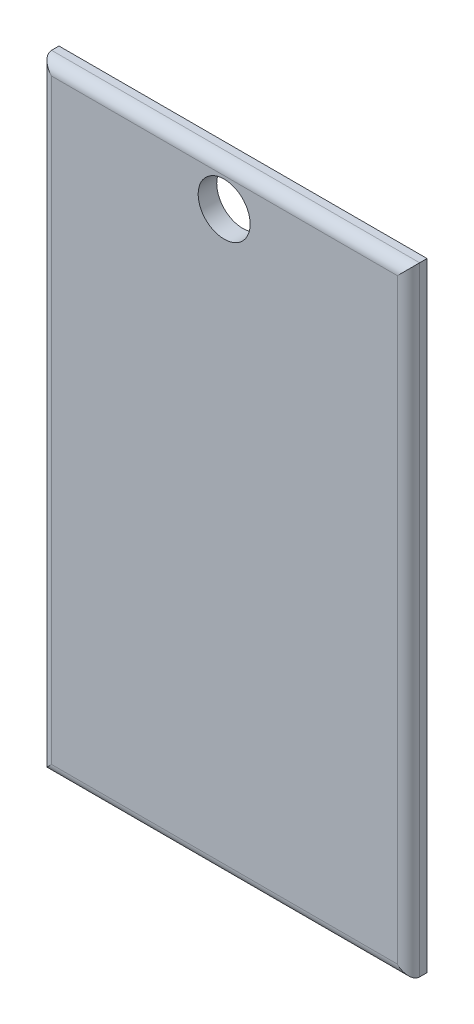
ISO-10303-21;
HEADER;
FILE_DESCRIPTION(('STEP AP214'),'2;1');
FILE_NAME('part.step','',(''),(''),'','','');
FILE_SCHEMA(('AUTOMOTIVE_DESIGN { 1 0 10303 214 1 1 1 1 }'));
ENDSEC;
DATA;
#1=APPLICATION_CONTEXT('core data for automotive mechanical design processes');
#2=APPLICATION_PROTOCOL_DEFINITION('international standard','automotive_design',2000,#1);
#3=PRODUCT_CONTEXT('',#1,'mechanical');
#4=PRODUCT('Part','Part','',(#3));
#5=PRODUCT_RELATED_PRODUCT_CATEGORY('part','',(#4));
#6=PRODUCT_DEFINITION_FORMATION('','',#4);
#7=PRODUCT_DEFINITION_CONTEXT('part definition',#1,'design');
#8=PRODUCT_DEFINITION('design','',#6,#7);
#9=PRODUCT_DEFINITION_SHAPE('','',#8);
#10=(LENGTH_UNIT() NAMED_UNIT(*) SI_UNIT(.MILLI.,.METRE.));
#11=(NAMED_UNIT(*) PLANE_ANGLE_UNIT() SI_UNIT($,.RADIAN.));
#12=(NAMED_UNIT(*) SI_UNIT($,.STERADIAN.) SOLID_ANGLE_UNIT());
#13=UNCERTAINTY_MEASURE_WITH_UNIT(LENGTH_MEASURE(1.E-05),#10,'distance_accuracy_value','');
#14=(GEOMETRIC_REPRESENTATION_CONTEXT(3) GLOBAL_UNCERTAINTY_ASSIGNED_CONTEXT((#13)) GLOBAL_UNIT_ASSIGNED_CONTEXT((#10,
#11,#12)) REPRESENTATION_CONTEXT('',''));
#15=CARTESIAN_POINT('',(0.,0.,0.));
#16=DIRECTION('',(0.,0.,1.));
#17=DIRECTION('',(1.,0.,0.));
#18=AXIS2_PLACEMENT_3D('',#15,#16,#17);
#19=CARTESIAN_POINT('',(-44.0525358152407,94.6577628041884,5.));
#20=DIRECTION('',(1.,0.,0.));
#21=DIRECTION('',(0.,1.,0.));
#22=AXIS2_PLACEMENT_3D('',#19,#20,#21);
#23=PLANE('',#22);
#24=DIRECTION('',(0.,0.,-1.));
#25=VECTOR('',#24,1.);
#26=CARTESIAN_POINT('',(-44.0525358152407,-71.8622371958116,5.));
#27=LINE('',#26,#25);
#28=CARTESIAN_POINT('',(-44.0525358152407,-71.8622371958116,2.));
#29=VERTEX_POINT('',#28);
#30=CARTESIAN_POINT('',(-44.0525358152407,-71.8622371958116,0.));
#31=VERTEX_POINT('',#30);
#32=EDGE_CURVE('E86',#29,#31,#27,.T.);
#33=ORIENTED_EDGE('',*,*,#32,.F.);
#34=DIRECTION('',(0.,-1.,0.));
#35=VECTOR('',#34,1.);
#36=CARTESIAN_POINT('',(-44.0525358152407,94.6577628041884,2.));
#37=LINE('',#36,#35);
#38=CARTESIAN_POINT('',(-44.0525358152407,94.6577628041884,2.));
#39=VERTEX_POINT('',#38);
#40=EDGE_CURVE('E11',#29,#39,#37,.F.);
#41=ORIENTED_EDGE('',*,*,#40,.T.);
#42=DIRECTION('',(0.,0.,-1.));
#43=VECTOR('',#42,1.);
#44=CARTESIAN_POINT('',(-44.0525358152407,94.6577628041884,5.));
#45=LINE('',#44,#43);
#46=CARTESIAN_POINT('',(-44.0525358152407,94.6577628041884,0.));
#47=VERTEX_POINT('',#46);
#48=EDGE_CURVE('E106',#39,#47,#45,.T.);
#49=ORIENTED_EDGE('',*,*,#48,.T.);
#50=DIRECTION('',(0.,-1.,0.));
#51=VECTOR('',#50,1.);
#52=CARTESIAN_POINT('',(-44.0525358152407,94.6577628041884,0.));
#53=LINE('',#52,#51);
#54=EDGE_CURVE('E102',#47,#31,#53,.T.);
#55=ORIENTED_EDGE('',*,*,#54,.T.);
#56=EDGE_LOOP('',(#33,#41,#49,#55));
#57=FACE_BOUND('',#56,.T.);
#58=ADVANCED_FACE('F33',(#57),#23,.F.);
#59=CARTESIAN_POINT('',(-44.0525358152407,-71.8622371958116,5.));
#60=DIRECTION('',(0.,1.,0.));
#61=DIRECTION('',(0.,0.,1.));
#62=AXIS2_PLACEMENT_3D('',#59,#60,#61);
#63=PLANE('',#62);
#64=DIRECTION('',(0.,0.,-1.));
#65=VECTOR('',#64,1.);
#66=CARTESIAN_POINT('',(55.0474641847593,-71.8622371958116,5.));
#67=LINE('',#66,#65);
#68=CARTESIAN_POINT('',(55.0474641847593,-71.8622371958116,2.));
#69=VERTEX_POINT('',#68);
#70=CARTESIAN_POINT('',(55.0474641847593,-71.8622371958116,0.));
#71=VERTEX_POINT('',#70);
#72=EDGE_CURVE('E96',#69,#71,#67,.T.);
#73=ORIENTED_EDGE('',*,*,#72,.F.);
#74=DIRECTION('',(1.,0.,0.));
#75=VECTOR('',#74,1.);
#76=CARTESIAN_POINT('',(-44.0525358152407,-71.8622371958116,2.));
#77=LINE('',#76,#75);
#78=EDGE_CURVE('E93',#69,#29,#77,.F.);
#79=ORIENTED_EDGE('',*,*,#78,.T.);
#80=ORIENTED_EDGE('',*,*,#32,.T.);
#81=DIRECTION('',(1.,0.,0.));
#82=VECTOR('',#81,1.);
#83=CARTESIAN_POINT('',(-44.0525358152407,-71.8622371958116,0.));
#84=LINE('',#83,#82);
#85=EDGE_CURVE('E90',#31,#71,#84,.T.);
#86=ORIENTED_EDGE('',*,*,#85,.T.);
#87=EDGE_LOOP('',(#73,#79,#80,#86));
#88=FACE_BOUND('',#87,.T.);
#89=ADVANCED_FACE('F89',(#88),#63,.F.);
#90=CARTESIAN_POINT('',(55.0474641847593,94.6577628041884,5.));
#91=DIRECTION('',(-1.,0.,0.));
#92=DIRECTION('',(0.,-1.,0.));
#93=AXIS2_PLACEMENT_3D('',#90,#91,#92);
#94=PLANE('',#93);
#95=DIRECTION('',(0.,0.,-1.));
#96=VECTOR('',#95,1.);
#97=CARTESIAN_POINT('',(55.0474641847593,94.6577628041884,5.));
#98=LINE('',#97,#96);
#99=CARTESIAN_POINT('',(55.0474641847593,94.6577628041884,2.));
#100=VERTEX_POINT('',#99);
#101=CARTESIAN_POINT('',(55.0474641847593,94.6577628041884,0.));
#102=VERTEX_POINT('',#101);
#103=EDGE_CURVE('E119',#100,#102,#98,.T.);
#104=ORIENTED_EDGE('',*,*,#103,.F.);
#105=DIRECTION('',(0.,1.,0.));
#106=VECTOR('',#105,1.);
#107=CARTESIAN_POINT('',(55.0474641847593,-71.8622371958116,2.));
#108=LINE('',#107,#106);
#109=EDGE_CURVE('E131',#100,#69,#108,.F.);
#110=ORIENTED_EDGE('',*,*,#109,.T.);
#111=ORIENTED_EDGE('',*,*,#72,.T.);
#112=DIRECTION('',(0.,1.,0.));
#113=VECTOR('',#112,1.);
#114=CARTESIAN_POINT('',(55.0474641847593,94.6577628041884,0.));
#115=LINE('',#114,#113);
#116=EDGE_CURVE('E104',#71,#102,#115,.T.);
#117=ORIENTED_EDGE('',*,*,#116,.T.);
#118=EDGE_LOOP('',(#104,#110,#111,#117));
#119=FACE_BOUND('',#118,.T.);
#120=ADVANCED_FACE('F168',(#119),#94,.F.);
#121=CARTESIAN_POINT('',(-44.0525358152407,94.6577628041884,5.));
#122=DIRECTION('',(0.,-1.,0.));
#123=DIRECTION('',(0.,0.,-1.));
#124=AXIS2_PLACEMENT_3D('',#121,#122,#123);
#125=PLANE('',#124);
#126=ORIENTED_EDGE('',*,*,#48,.F.);
#127=DIRECTION('',(-1.,0.,0.));
#128=VECTOR('',#127,1.);
#129=CARTESIAN_POINT('',(55.0474641847593,94.6577628041884,2.));
#130=LINE('',#129,#128);
#131=EDGE_CURVE('E42',#39,#100,#130,.F.);
#132=ORIENTED_EDGE('',*,*,#131,.T.);
#133=ORIENTED_EDGE('',*,*,#103,.T.);
#134=DIRECTION('',(-1.,0.,0.));
#135=VECTOR('',#134,1.);
#136=CARTESIAN_POINT('',(-44.0525358152407,94.6577628041884,0.));
#137=LINE('',#136,#135);
#138=EDGE_CURVE('E116',#102,#47,#137,.T.);
#139=ORIENTED_EDGE('',*,*,#138,.T.);
#140=EDGE_LOOP('',(#126,#132,#133,#139));
#141=FACE_BOUND('',#140,.T.);
#142=ADVANCED_FACE('F192',(#141),#125,.F.);
#143=CARTESIAN_POINT('',(0.,0.,5.));
#144=DIRECTION('',(0.,0.,1.));
#145=DIRECTION('',(1.,0.,0.));
#146=AXIS2_PLACEMENT_3D('',#143,#144,#145);
#147=PLANE('',#146);
#148=CARTESIAN_POINT('',(5.4186749701905,83.8577628041884,5.));
#149=DIRECTION('',(0.,0.,1.));
#150=DIRECTION('',(1.,0.,0.));
#151=AXIS2_PLACEMENT_3D('',#148,#149,#150);
#152=CIRCLE('',#151,7.00000000000001);
#153=CARTESIAN_POINT('',(12.4186749701905,83.8577628041884,5.));
#154=VERTEX_POINT('',#153);
#155=EDGE_CURVE('E323',#154,#154,#152,.T.);
#156=ORIENTED_EDGE('',*,*,#155,.F.);
#157=EDGE_LOOP('',(#156));
#158=FACE_BOUND('',#157,.T.);
#159=DIRECTION('',(0.,-1.,0.));
#160=VECTOR('',#159,1.);
#161=CARTESIAN_POINT('',(-41.0525358152407,-71.8622371958116,5.));
#162=LINE('',#161,#160);
#163=CARTESIAN_POINT('',(-41.0525358152407,91.6577628041884,5.));
#164=VERTEX_POINT('',#163);
#165=CARTESIAN_POINT('',(-41.0525358152407,-68.8622371958116,5.));
#166=VERTEX_POINT('',#165);
#167=EDGE_CURVE('E95',#164,#166,#162,.T.);
#168=ORIENTED_EDGE('',*,*,#167,.T.);
#169=DIRECTION('',(1.,0.,0.));
#170=VECTOR('',#169,1.);
#171=CARTESIAN_POINT('',(55.0474641847593,-68.8622371958116,5.));
#172=LINE('',#171,#170);
#173=CARTESIAN_POINT('',(52.0474641847593,-68.8622371958116,5.));
#174=VERTEX_POINT('',#173);
#175=EDGE_CURVE('E127',#166,#174,#172,.T.);
#176=ORIENTED_EDGE('',*,*,#175,.T.);
#177=DIRECTION('',(0.,1.,0.));
#178=VECTOR('',#177,1.);
#179=CARTESIAN_POINT('',(52.0474641847593,94.6577628041884,5.));
#180=LINE('',#179,#178);
#181=CARTESIAN_POINT('',(52.0474641847593,91.6577628041884,5.));
#182=VERTEX_POINT('',#181);
#183=EDGE_CURVE('E125',#174,#182,#180,.T.);
#184=ORIENTED_EDGE('',*,*,#183,.T.);
#185=DIRECTION('',(-1.,0.,0.));
#186=VECTOR('',#185,1.);
#187=CARTESIAN_POINT('',(-44.0525358152407,91.6577628041884,5.));
#188=LINE('',#187,#186);
#189=EDGE_CURVE('E123',#182,#164,#188,.T.);
#190=ORIENTED_EDGE('',*,*,#189,.T.);
#191=EDGE_LOOP('',(#168,#176,#184,#190));
#192=FACE_BOUND('',#191,.T.);
#193=ADVANCED_FACE('F150',(#158,#192),#147,.T.);
#194=CARTESIAN_POINT('',(0.,0.,0.));
#195=DIRECTION('',(0.,0.,1.));
#196=DIRECTION('',(1.,0.,0.));
#197=AXIS2_PLACEMENT_3D('',#194,#195,#196);
#198=PLANE('',#197);
#199=CARTESIAN_POINT('',(5.4186749701905,83.8577628041884,0.));
#200=DIRECTION('',(0.,0.,-1.));
#201=DIRECTION('',(-1.,0.,0.));
#202=AXIS2_PLACEMENT_3D('',#199,#200,#201);
#203=CIRCLE('',#202,7.00000000000001);
#204=CARTESIAN_POINT('',(-1.58132502980951,83.8577628041884,0.));
#205=VERTEX_POINT('',#204);
#206=EDGE_CURVE('E326',#205,#205,#203,.T.);
#207=ORIENTED_EDGE('',*,*,#206,.F.);
#208=EDGE_LOOP('',(#207));
#209=FACE_BOUND('',#208,.T.);
#210=CARTESIAN_POINT('',(-40.5025358152407,-68.3122371958116,0.));
#211=DIRECTION('',(0.,0.,-1.));
#212=DIRECTION('',(-1.,0.,0.));
#213=AXIS2_PLACEMENT_3D('',#210,#211,#212);
#214=CIRCLE('',#213,3.1);
#215=CARTESIAN_POINT('',(-43.6025358152407,-68.3122371958116,0.));
#216=VERTEX_POINT('',#215);
#217=EDGE_CURVE('E328',#216,#216,#214,.T.);
#218=ORIENTED_EDGE('',*,*,#217,.F.);
#219=EDGE_LOOP('',(#218));
#220=FACE_BOUND('',#219,.T.);
#221=CARTESIAN_POINT('',(51.4974641847593,-68.3122371958116,0.));
#222=DIRECTION('',(0.,0.,-1.));
#223=DIRECTION('',(-1.,0.,0.));
#224=AXIS2_PLACEMENT_3D('',#221,#222,#223);
#225=CIRCLE('',#224,3.1);
#226=CARTESIAN_POINT('',(48.3974641847593,-68.3122371958116,0.));
#227=VERTEX_POINT('',#226);
#228=EDGE_CURVE('E334',#227,#227,#225,.T.);
#229=ORIENTED_EDGE('',*,*,#228,.F.);
#230=EDGE_LOOP('',(#229));
#231=FACE_BOUND('',#230,.T.);
#232=CARTESIAN_POINT('',(-40.5025358152407,91.1077628041884,0.));
#233=DIRECTION('',(0.,0.,-1.));
#234=DIRECTION('',(-1.,0.,0.));
#235=AXIS2_PLACEMENT_3D('',#232,#233,#234);
#236=CIRCLE('',#235,3.1);
#237=CARTESIAN_POINT('',(-43.6025358152407,91.1077628041884,0.));
#238=VERTEX_POINT('',#237);
#239=EDGE_CURVE('E340',#238,#238,#236,.T.);
#240=ORIENTED_EDGE('',*,*,#239,.F.);
#241=EDGE_LOOP('',(#240));
#242=FACE_BOUND('',#241,.T.);
#243=CARTESIAN_POINT('',(51.4974641847593,91.1077628041884,0.));
#244=DIRECTION('',(0.,0.,-1.));
#245=DIRECTION('',(-1.,0.,0.));
#246=AXIS2_PLACEMENT_3D('',#243,#244,#245);
#247=CIRCLE('',#246,3.1);
#248=CARTESIAN_POINT('',(48.3974641847593,91.1077628041884,0.));
#249=VERTEX_POINT('',#248);
#250=EDGE_CURVE('E112',#249,#249,#247,.T.);
#251=ORIENTED_EDGE('',*,*,#250,.F.);
#252=EDGE_LOOP('',(#251));
#253=FACE_BOUND('',#252,.T.);
#254=ORIENTED_EDGE('',*,*,#54,.F.);
#255=ORIENTED_EDGE('',*,*,#138,.F.);
#256=ORIENTED_EDGE('',*,*,#116,.F.);
#257=ORIENTED_EDGE('',*,*,#85,.F.);
#258=EDGE_LOOP('',(#254,#255,#256,#257));
#259=FACE_BOUND('',#258,.T.);
#260=ADVANCED_FACE('F100',(#209,#220,#231,#242,#253,#259),#198,.F.);
#261=CARTESIAN_POINT('',(0.,91.6577628041884,2.));
#262=DIRECTION('',(1.,0.,0.));
#263=DIRECTION('',(0.,0.,-1.));
#264=AXIS2_PLACEMENT_3D('',#261,#262,#263);
#265=CYLINDRICAL_SURFACE('',#264,3.);
#266=CARTESIAN_POINT('',(52.0474641847593,91.6577628041884,2.));
#267=DIRECTION('',(0.707106781186547,-0.707106781186547,0.));
#268=DIRECTION('',(0.707106781186547,0.707106781186547,0.));
#269=AXIS2_PLACEMENT_3D('',#266,#267,#268);
#270=ELLIPSE('',#269,4.24264068711928,3.);
#271=EDGE_CURVE('E110',#100,#182,#270,.T.);
#272=ORIENTED_EDGE('',*,*,#271,.F.);
#273=ORIENTED_EDGE('',*,*,#131,.F.);
#274=CARTESIAN_POINT('',(-41.0525358152407,91.6577628041884,2.));
#275=DIRECTION('',(0.707106781186547,0.707106781186548,0.));
#276=DIRECTION('',(-0.707106781186548,0.707106781186547,0.));
#277=AXIS2_PLACEMENT_3D('',#274,#275,#276);
#278=ELLIPSE('',#277,4.24264068711929,3.);
#279=EDGE_CURVE('E37',#164,#39,#278,.F.);
#280=ORIENTED_EDGE('',*,*,#279,.F.);
#281=ORIENTED_EDGE('',*,*,#189,.F.);
#282=EDGE_LOOP('',(#272,#273,#280,#281));
#283=FACE_BOUND('',#282,.T.);
#284=ADVANCED_FACE('F35',(#283),#265,.T.);
#285=CARTESIAN_POINT('',(-41.0525358152407,0.,2.));
#286=DIRECTION('',(0.,1.,0.));
#287=DIRECTION('',(-1.,0.,0.));
#288=AXIS2_PLACEMENT_3D('',#285,#286,#287);
#289=CYLINDRICAL_SURFACE('',#288,3.);
#290=ORIENTED_EDGE('',*,*,#279,.T.);
#291=ORIENTED_EDGE('',*,*,#40,.F.);
#292=CARTESIAN_POINT('',(-41.0525358152407,-68.8622371958116,2.));
#293=DIRECTION('',(-0.707106781186548,0.707106781186547,0.));
#294=DIRECTION('',(0.707106781186547,0.707106781186548,0.));
#295=AXIS2_PLACEMENT_3D('',#292,#293,#294);
#296=ELLIPSE('',#295,4.24264068711928,3.);
#297=EDGE_CURVE('E136',#166,#29,#296,.F.);
#298=ORIENTED_EDGE('',*,*,#297,.F.);
#299=ORIENTED_EDGE('',*,*,#167,.F.);
#300=EDGE_LOOP('',(#290,#291,#298,#299));
#301=FACE_BOUND('',#300,.T.);
#302=ADVANCED_FACE('F156',(#301),#289,.T.);
#303=CARTESIAN_POINT('',(52.0474641847593,0.,2.));
#304=DIRECTION('',(0.,-1.,0.));
#305=DIRECTION('',(1.,0.,0.));
#306=AXIS2_PLACEMENT_3D('',#303,#304,#305);
#307=CYLINDRICAL_SURFACE('',#306,3.);
#308=ORIENTED_EDGE('',*,*,#271,.T.);
#309=ORIENTED_EDGE('',*,*,#183,.F.);
#310=CARTESIAN_POINT('',(52.0474641847593,-68.8622371958116,2.));
#311=DIRECTION('',(-0.707106781186547,-0.707106781186547,0.));
#312=DIRECTION('',(0.707106781186547,-0.707106781186547,0.));
#313=AXIS2_PLACEMENT_3D('',#310,#311,#312);
#314=ELLIPSE('',#313,4.24264068711928,3.);
#315=EDGE_CURVE('E134',#69,#174,#314,.T.);
#316=ORIENTED_EDGE('',*,*,#315,.F.);
#317=ORIENTED_EDGE('',*,*,#109,.F.);
#318=EDGE_LOOP('',(#308,#309,#316,#317));
#319=FACE_BOUND('',#318,.T.);
#320=ADVANCED_FACE('F143',(#319),#307,.T.);
#321=CARTESIAN_POINT('',(0.,-68.8622371958116,2.));
#322=DIRECTION('',(-1.,0.,0.));
#323=DIRECTION('',(0.,0.,1.));
#324=AXIS2_PLACEMENT_3D('',#321,#322,#323);
#325=CYLINDRICAL_SURFACE('',#324,3.);
#326=ORIENTED_EDGE('',*,*,#297,.T.);
#327=ORIENTED_EDGE('',*,*,#78,.F.);
#328=ORIENTED_EDGE('',*,*,#315,.T.);
#329=ORIENTED_EDGE('',*,*,#175,.F.);
#330=EDGE_LOOP('',(#326,#327,#328,#329));
#331=FACE_BOUND('',#330,.T.);
#332=ADVANCED_FACE('F154',(#331),#325,.T.);
#333=CARTESIAN_POINT('',(51.4974641847593,91.1077628041884,1.6));
#334=DIRECTION('',(0.,0.,-1.));
#335=DIRECTION('',(-1.,0.,0.));
#336=AXIS2_PLACEMENT_3D('',#333,#334,#335);
#337=CYLINDRICAL_SURFACE('',#336,3.1);
#338=CARTESIAN_POINT('',(51.4974641847593,91.1077628041884,1.6));
#339=DIRECTION('',(0.,0.,-1.));
#340=DIRECTION('',(-1.,0.,0.));
#341=AXIS2_PLACEMENT_3D('',#338,#339,#340);
#342=CIRCLE('',#341,3.1);
#343=CARTESIAN_POINT('',(48.3974641847593,91.1077628041884,1.6));
#344=VERTEX_POINT('',#343);
#345=EDGE_CURVE('E137',#344,#344,#342,.T.);
#346=ORIENTED_EDGE('',*,*,#345,.F.);
#347=EDGE_LOOP('',(#346));
#348=FACE_BOUND('',#347,.T.);
#349=ORIENTED_EDGE('',*,*,#250,.T.);
#350=EDGE_LOOP('',(#349));
#351=FACE_BOUND('',#350,.T.);
#352=ADVANCED_FACE('F173',(#348,#351),#337,.F.);
#353=CARTESIAN_POINT('',(51.4974641847593,91.1077628041884,1.6));
#354=DIRECTION('',(0.,0.,-1.));
#355=DIRECTION('',(-1.,0.,0.));
#356=AXIS2_PLACEMENT_3D('',#353,#354,#355);
#357=PLANE('',#356);
#358=ORIENTED_EDGE('',*,*,#345,.T.);
#359=EDGE_LOOP('',(#358));
#360=FACE_BOUND('',#359,.T.);
#361=ADVANCED_FACE('F177',(#360),#357,.T.);
#362=CARTESIAN_POINT('',(-40.5025358152407,91.1077628041884,1.6));
#363=DIRECTION('',(0.,0.,-1.));
#364=DIRECTION('',(-1.,0.,0.));
#365=AXIS2_PLACEMENT_3D('',#362,#363,#364);
#366=CYLINDRICAL_SURFACE('',#365,3.1);
#367=CARTESIAN_POINT('',(-40.5025358152407,91.1077628041884,1.6));
#368=DIRECTION('',(0.,0.,-1.));
#369=DIRECTION('',(-1.,0.,0.));
#370=AXIS2_PLACEMENT_3D('',#367,#368,#369);
#371=CIRCLE('',#370,3.1);
#372=CARTESIAN_POINT('',(-43.6025358152407,91.1077628041884,1.6));
#373=VERTEX_POINT('',#372);
#374=EDGE_CURVE('E343',#373,#373,#371,.T.);
#375=ORIENTED_EDGE('',*,*,#374,.F.);
#376=EDGE_LOOP('',(#375));
#377=FACE_BOUND('',#376,.T.);
#378=ORIENTED_EDGE('',*,*,#239,.T.);
#379=EDGE_LOOP('',(#378));
#380=FACE_BOUND('',#379,.T.);
#381=ADVANCED_FACE('F183',(#377,#380),#366,.F.);
#382=CARTESIAN_POINT('',(-40.5025358152407,91.1077628041884,1.6));
#383=DIRECTION('',(0.,0.,-1.));
#384=DIRECTION('',(-1.,0.,0.));
#385=AXIS2_PLACEMENT_3D('',#382,#383,#384);
#386=PLANE('',#385);
#387=ORIENTED_EDGE('',*,*,#374,.T.);
#388=EDGE_LOOP('',(#387));
#389=FACE_BOUND('',#388,.T.);
#390=ADVANCED_FACE('F259',(#389),#386,.T.);
#391=CARTESIAN_POINT('',(51.4974641847593,-68.3122371958116,1.6));
#392=DIRECTION('',(0.,0.,-1.));
#393=DIRECTION('',(-1.,0.,0.));
#394=AXIS2_PLACEMENT_3D('',#391,#392,#393);
#395=CYLINDRICAL_SURFACE('',#394,3.1);
#396=CARTESIAN_POINT('',(51.4974641847593,-68.3122371958116,1.6));
#397=DIRECTION('',(0.,0.,-1.));
#398=DIRECTION('',(-1.,0.,0.));
#399=AXIS2_PLACEMENT_3D('',#396,#397,#398);
#400=CIRCLE('',#399,3.1);
#401=CARTESIAN_POINT('',(48.3974641847593,-68.3122371958116,1.6));
#402=VERTEX_POINT('',#401);
#403=EDGE_CURVE('E337',#402,#402,#400,.T.);
#404=ORIENTED_EDGE('',*,*,#403,.F.);
#405=EDGE_LOOP('',(#404));
#406=FACE_BOUND('',#405,.T.);
#407=ORIENTED_EDGE('',*,*,#228,.T.);
#408=EDGE_LOOP('',(#407));
#409=FACE_BOUND('',#408,.T.);
#410=ADVANCED_FACE('F268',(#406,#409),#395,.F.);
#411=CARTESIAN_POINT('',(51.4974641847593,-68.3122371958116,1.6));
#412=DIRECTION('',(0.,0.,-1.));
#413=DIRECTION('',(-1.,0.,0.));
#414=AXIS2_PLACEMENT_3D('',#411,#412,#413);
#415=PLANE('',#414);
#416=ORIENTED_EDGE('',*,*,#403,.T.);
#417=EDGE_LOOP('',(#416));
#418=FACE_BOUND('',#417,.T.);
#419=ADVANCED_FACE('F278',(#418),#415,.T.);
#420=CARTESIAN_POINT('',(-40.5025358152407,-68.3122371958116,1.6));
#421=DIRECTION('',(0.,0.,-1.));
#422=DIRECTION('',(-1.,0.,0.));
#423=AXIS2_PLACEMENT_3D('',#420,#421,#422);
#424=CYLINDRICAL_SURFACE('',#423,3.1);
#425=CARTESIAN_POINT('',(-40.5025358152407,-68.3122371958116,1.6));
#426=DIRECTION('',(0.,0.,-1.));
#427=DIRECTION('',(-1.,0.,0.));
#428=AXIS2_PLACEMENT_3D('',#425,#426,#427);
#429=CIRCLE('',#428,3.1);
#430=CARTESIAN_POINT('',(-43.6025358152407,-68.3122371958116,1.6));
#431=VERTEX_POINT('',#430);
#432=EDGE_CURVE('E331',#431,#431,#429,.T.);
#433=ORIENTED_EDGE('',*,*,#432,.F.);
#434=EDGE_LOOP('',(#433));
#435=FACE_BOUND('',#434,.T.);
#436=ORIENTED_EDGE('',*,*,#217,.T.);
#437=EDGE_LOOP('',(#436));
#438=FACE_BOUND('',#437,.T.);
#439=ADVANCED_FACE('F288',(#435,#438),#424,.F.);
#440=CARTESIAN_POINT('',(-40.5025358152407,-68.3122371958116,1.6));
#441=DIRECTION('',(0.,0.,-1.));
#442=DIRECTION('',(-1.,0.,0.));
#443=AXIS2_PLACEMENT_3D('',#440,#441,#442);
#444=PLANE('',#443);
#445=ORIENTED_EDGE('',*,*,#432,.T.);
#446=EDGE_LOOP('',(#445));
#447=FACE_BOUND('',#446,.T.);
#448=ADVANCED_FACE('F297',(#447),#444,.T.);
#449=CARTESIAN_POINT('',(5.4186749701905,83.8577628041884,10.));
#450=DIRECTION('',(0.,0.,-1.));
#451=DIRECTION('',(-1.,0.,0.));
#452=AXIS2_PLACEMENT_3D('',#449,#450,#451);
#453=CYLINDRICAL_SURFACE('',#452,7.00000000000001);
#454=ORIENTED_EDGE('',*,*,#155,.T.);
#455=EDGE_LOOP('',(#454));
#456=FACE_BOUND('',#455,.T.);
#457=ORIENTED_EDGE('',*,*,#206,.T.);
#458=EDGE_LOOP('',(#457));
#459=FACE_BOUND('',#458,.T.);
#460=ADVANCED_FACE('F306',(#456,#459),#453,.F.);
#461=CLOSED_SHELL('',(#58,#89,#120,#142,#193,#260,#284,#302,#320,#332,#352,#361,#381,#390,#410,
#419,#439,#448,#460));
#462=MANIFOLD_SOLID_BREP('B2',#461);
#463=ADVANCED_BREP_SHAPE_REPRESENTATION('',(#18,#462),#14);
#464=SHAPE_DEFINITION_REPRESENTATION(#9,#463);
ENDSEC;
END-ISO-10303-21;
